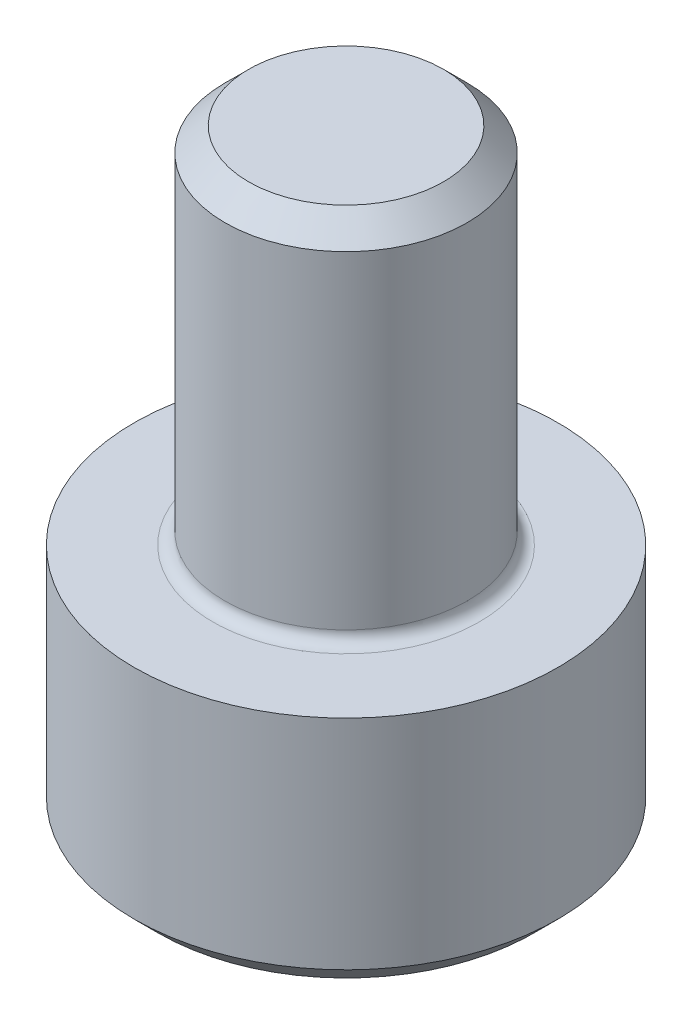
ISO-10303-21;
HEADER;
FILE_DESCRIPTION(('STEP AP214'),'2;1');
FILE_NAME('part.step','',(''),(''),'','','');
FILE_SCHEMA(('AUTOMOTIVE_DESIGN { 1 0 10303 214 1 1 1 1 }'));
ENDSEC;
DATA;
#1=APPLICATION_CONTEXT('core data for automotive mechanical design processes');
#2=APPLICATION_PROTOCOL_DEFINITION('international standard','automotive_design',2000,#1);
#3=PRODUCT_CONTEXT('',#1,'mechanical');
#4=PRODUCT('Part','Part','',(#3));
#5=PRODUCT_RELATED_PRODUCT_CATEGORY('part','',(#4));
#6=PRODUCT_DEFINITION_FORMATION('','',#4);
#7=PRODUCT_DEFINITION_CONTEXT('part definition',#1,'design');
#8=PRODUCT_DEFINITION('design','',#6,#7);
#9=PRODUCT_DEFINITION_SHAPE('','',#8);
#10=(LENGTH_UNIT() NAMED_UNIT(*) SI_UNIT(.MILLI.,.METRE.));
#11=(NAMED_UNIT(*) PLANE_ANGLE_UNIT() SI_UNIT($,.RADIAN.));
#12=(NAMED_UNIT(*) SI_UNIT($,.STERADIAN.) SOLID_ANGLE_UNIT());
#13=UNCERTAINTY_MEASURE_WITH_UNIT(LENGTH_MEASURE(1.E-05),#10,'distance_accuracy_value','');
#14=(GEOMETRIC_REPRESENTATION_CONTEXT(3) GLOBAL_UNCERTAINTY_ASSIGNED_CONTEXT((#13)) GLOBAL_UNIT_ASSIGNED_CONTEXT((#10,
#11,#12)) REPRESENTATION_CONTEXT('',''));
#15=CARTESIAN_POINT('',(0.,0.,0.));
#16=DIRECTION('',(0.,0.,1.));
#17=DIRECTION('',(1.,0.,0.));
#18=AXIS2_PLACEMENT_3D('',#15,#16,#17);
#19=CARTESIAN_POINT('',(8.00000000000001,-78.,-28.9136645896017));
#20=DIRECTION('',(0.,-1.,0.));
#21=DIRECTION('',(0.,0.,1.));
#22=AXIS2_PLACEMENT_3D('',#19,#20,#21);
#23=PLANE('',#22);
#24=DIRECTION('',(0.499999999999999,0.,0.866025403784439));
#25=VECTOR('',#24,1.);
#26=CARTESIAN_POINT('',(6.22695732331867,-78.,-28.9136645896017));
#27=LINE('',#26,#25);
#28=CARTESIAN_POINT('',(6.22695732331867,-78.,-28.9136645896017));
#29=VERTEX_POINT('',#28);
#30=CARTESIAN_POINT('',(7.11347866165934,-78.,-27.3781645896017));
#31=VERTEX_POINT('',#30);
#32=EDGE_CURVE('E269',#29,#31,#27,.T.);
#33=ORIENTED_EDGE('',*,*,#32,.T.);
#34=DIRECTION('',(-1.,0.,0.));
#35=VECTOR('',#34,1.);
#36=CARTESIAN_POINT('',(8.88652133834068,-78.,-27.3781645896017));
#37=LINE('',#36,#35);
#38=CARTESIAN_POINT('',(8.88652133834068,-78.,-27.3781645896017));
#39=VERTEX_POINT('',#38);
#40=EDGE_CURVE('E124',#39,#31,#37,.T.);
#41=ORIENTED_EDGE('',*,*,#40,.F.);
#42=DIRECTION('',(0.500000000000001,0.,-0.866025403784438));
#43=VECTOR('',#42,1.);
#44=CARTESIAN_POINT('',(8.88652133834068,-78.,-27.3781645896017));
#45=LINE('',#44,#43);
#46=CARTESIAN_POINT('',(9.77304267668135,-78.,-28.9136645896017));
#47=VERTEX_POINT('',#46);
#48=EDGE_CURVE('E272',#39,#47,#45,.T.);
#49=ORIENTED_EDGE('',*,*,#48,.T.);
#50=DIRECTION('',(-0.499999999999999,0.,-0.866025403784439));
#51=VECTOR('',#50,1.);
#52=CARTESIAN_POINT('',(9.77304267668135,-78.,-28.9136645896017));
#53=LINE('',#52,#51);
#54=CARTESIAN_POINT('',(8.88652133834068,-78.,-30.4491645896017));
#55=VERTEX_POINT('',#54);
#56=EDGE_CURVE('E275',#47,#55,#53,.T.);
#57=ORIENTED_EDGE('',*,*,#56,.T.);
#58=DIRECTION('',(1.,0.,0.));
#59=VECTOR('',#58,1.);
#60=CARTESIAN_POINT('',(7.11347866165934,-78.,-30.4491645896017));
#61=LINE('',#60,#59);
#62=CARTESIAN_POINT('',(7.11347866165934,-78.,-30.4491645896017));
#63=VERTEX_POINT('',#62);
#64=EDGE_CURVE('E278',#63,#55,#61,.T.);
#65=ORIENTED_EDGE('',*,*,#64,.F.);
#66=DIRECTION('',(0.500000000000001,0.,-0.866025403784438));
#67=VECTOR('',#66,1.);
#68=CARTESIAN_POINT('',(6.22695732331867,-78.,-28.9136645896017));
#69=LINE('',#68,#67);
#70=EDGE_CURVE('E119',#29,#63,#69,.T.);
#71=ORIENTED_EDGE('',*,*,#70,.F.);
#72=EDGE_LOOP('',(#33,#41,#49,#57,#65,#71));
#73=FACE_BOUND('',#72,.T.);
#74=CARTESIAN_POINT('',(8.00000000000001,-78.,-28.9136645896017));
#75=DIRECTION('',(0.,-1.,0.));
#76=DIRECTION('',(0.,0.,1.));
#77=AXIS2_PLACEMENT_3D('',#74,#75,#76);
#78=CIRCLE('',#77,3.1);
#79=CARTESIAN_POINT('',(8.00000000000001,-78.,-25.8136645896017));
#80=VERTEX_POINT('',#79);
#81=EDGE_CURVE('E148',#80,#80,#78,.T.);
#82=ORIENTED_EDGE('',*,*,#81,.T.);
#83=EDGE_LOOP('',(#82));
#84=FACE_BOUND('',#83,.T.);
#85=ADVANCED_FACE('F32',(#73,#84),#23,.T.);
#86=CARTESIAN_POINT('',(8.00000000000001,-78.,-28.9136645896017));
#87=DIRECTION('',(0.,1.,0.));
#88=DIRECTION('',(0.,0.,-1.));
#89=AXIS2_PLACEMENT_3D('',#86,#87,#88);
#90=CONICAL_SURFACE('',#89,3.1,0.785398163397451);
#91=CARTESIAN_POINT('',(8.00000000000001,-77.6,-28.9136645896017));
#92=DIRECTION('',(0.,-1.,0.));
#93=DIRECTION('',(0.,0.,1.));
#94=AXIS2_PLACEMENT_3D('',#91,#92,#93);
#95=CIRCLE('',#94,3.5);
#96=CARTESIAN_POINT('',(8.00000000000001,-77.6,-25.4136645896017));
#97=VERTEX_POINT('',#96);
#98=EDGE_CURVE('E145',#97,#97,#95,.T.);
#99=ORIENTED_EDGE('',*,*,#98,.T.);
#100=EDGE_LOOP('',(#99));
#101=FACE_BOUND('',#100,.T.);
#102=ORIENTED_EDGE('',*,*,#81,.F.);
#103=EDGE_LOOP('',(#102));
#104=FACE_BOUND('',#103,.T.);
#105=ADVANCED_FACE('F170',(#101,#104),#90,.T.);
#106=CARTESIAN_POINT('',(8.00000000000001,-109.75,-28.9136645896017));
#107=DIRECTION('',(0.,-1.,0.));
#108=DIRECTION('',(0.,0.,1.));
#109=AXIS2_PLACEMENT_3D('',#106,#107,#108);
#110=CYLINDRICAL_SURFACE('',#109,3.5);
#111=CARTESIAN_POINT('',(8.00000000000001,-74.,-28.9136645896017));
#112=DIRECTION('',(0.,-1.,0.));
#113=DIRECTION('',(0.,0.,1.));
#114=AXIS2_PLACEMENT_3D('',#111,#112,#113);
#115=CIRCLE('',#114,3.5);
#116=CARTESIAN_POINT('',(8.00000000000001,-74.,-25.4136645896017));
#117=VERTEX_POINT('',#116);
#118=EDGE_CURVE('E142',#117,#117,#115,.T.);
#119=ORIENTED_EDGE('',*,*,#118,.T.);
#120=EDGE_LOOP('',(#119));
#121=FACE_BOUND('',#120,.T.);
#122=ORIENTED_EDGE('',*,*,#98,.F.);
#123=EDGE_LOOP('',(#122));
#124=FACE_BOUND('',#123,.T.);
#125=ADVANCED_FACE('F176',(#121,#124),#110,.T.);
#126=CARTESIAN_POINT('',(4.50000000000001,-74.,-28.9136645896017));
#127=DIRECTION('',(0.,1.,0.));
#128=DIRECTION('',(0.,0.,-1.));
#129=AXIS2_PLACEMENT_3D('',#126,#127,#128);
#130=PLANE('',#129);
#131=CARTESIAN_POINT('',(8.00000000000001,-74.,-28.9136645896017));
#132=DIRECTION('',(0.,1.,0.));
#133=DIRECTION('',(0.,0.,-1.));
#134=AXIS2_PLACEMENT_3D('',#131,#132,#133);
#135=CIRCLE('',#134,2.2);
#136=CARTESIAN_POINT('',(8.00000000000001,-74.,-31.1136645896017));
#137=VERTEX_POINT('',#136);
#138=EDGE_CURVE('E40',#137,#137,#135,.F.);
#139=ORIENTED_EDGE('',*,*,#138,.T.);
#140=EDGE_LOOP('',(#139));
#141=FACE_BOUND('',#140,.T.);
#142=ORIENTED_EDGE('',*,*,#118,.F.);
#143=EDGE_LOOP('',(#142));
#144=FACE_BOUND('',#143,.T.);
#145=ADVANCED_FACE('F153',(#141,#144),#130,.T.);
#146=CARTESIAN_POINT('',(8.00000000000001,-109.75,-28.9136645896017));
#147=DIRECTION('',(0.,-1.,0.));
#148=DIRECTION('',(0.,0.,1.));
#149=AXIS2_PLACEMENT_3D('',#146,#147,#148);
#150=CYLINDRICAL_SURFACE('',#149,2.);
#151=CARTESIAN_POINT('',(8.00000000000001,-73.8,-28.9136645896017));
#152=DIRECTION('',(0.,1.,0.));
#153=DIRECTION('',(0.,0.,-1.));
#154=AXIS2_PLACEMENT_3D('',#151,#152,#153);
#155=CIRCLE('',#154,2.);
#156=CARTESIAN_POINT('',(8.00000000000001,-73.8,-30.9136645896017));
#157=VERTEX_POINT('',#156);
#158=EDGE_CURVE('E11',#157,#157,#155,.T.);
#159=ORIENTED_EDGE('',*,*,#158,.T.);
#160=EDGE_LOOP('',(#159));
#161=FACE_BOUND('',#160,.T.);
#162=CARTESIAN_POINT('',(8.00000000000001,-68.39,-28.9136645896017));
#163=DIRECTION('',(0.,-1.,0.));
#164=DIRECTION('',(0.,0.,1.));
#165=AXIS2_PLACEMENT_3D('',#162,#163,#164);
#166=CIRCLE('',#165,2.);
#167=CARTESIAN_POINT('',(8.00000000000001,-68.39,-26.9136645896016));
#168=VERTEX_POINT('',#167);
#169=EDGE_CURVE('E139',#168,#168,#166,.T.);
#170=ORIENTED_EDGE('',*,*,#169,.T.);
#171=EDGE_LOOP('',(#170));
#172=FACE_BOUND('',#171,.T.);
#173=ADVANCED_FACE('F186',(#161,#172),#150,.T.);
#174=CARTESIAN_POINT('',(8.00000000000001,-68.,-28.9136645896017));
#175=DIRECTION('',(0.,-1.,0.));
#176=DIRECTION('',(0.,0.,1.));
#177=AXIS2_PLACEMENT_3D('',#174,#175,#176);
#178=CONICAL_SURFACE('',#177,1.61,0.785398163397465);
#179=ORIENTED_EDGE('',*,*,#169,.F.);
#180=EDGE_LOOP('',(#179));
#181=FACE_BOUND('',#180,.T.);
#182=CARTESIAN_POINT('',(8.00000000000001,-68.,-28.9136645896017));
#183=DIRECTION('',(0.,-1.,0.));
#184=DIRECTION('',(0.,0.,1.));
#185=AXIS2_PLACEMENT_3D('',#182,#183,#184);
#186=CIRCLE('',#185,1.61);
#187=CARTESIAN_POINT('',(8.00000000000001,-68.,-27.3036645896017));
#188=VERTEX_POINT('',#187);
#189=EDGE_CURVE('E135',#188,#188,#186,.T.);
#190=ORIENTED_EDGE('',*,*,#189,.T.);
#191=EDGE_LOOP('',(#190));
#192=FACE_BOUND('',#191,.T.);
#193=ADVANCED_FACE('F165',(#181,#192),#178,.T.);
#194=CARTESIAN_POINT('',(6.39000000000001,-68.,-28.9136645896017));
#195=DIRECTION('',(0.,1.,0.));
#196=DIRECTION('',(0.,0.,-1.));
#197=AXIS2_PLACEMENT_3D('',#194,#195,#196);
#198=PLANE('',#197);
#199=ORIENTED_EDGE('',*,*,#189,.F.);
#200=EDGE_LOOP('',(#199));
#201=FACE_BOUND('',#200,.T.);
#202=ADVANCED_FACE('F157',(#201),#198,.T.);
#203=CARTESIAN_POINT('',(8.00000000000001,-73.8,-28.9136645896017));
#204=DIRECTION('',(0.,1.,0.));
#205=DIRECTION('',(0.,0.,-1.));
#206=AXIS2_PLACEMENT_3D('',#203,#204,#205);
#207=TOROIDAL_SURFACE('',#206,2.2,0.2);
#208=ORIENTED_EDGE('',*,*,#158,.F.);
#209=EDGE_LOOP('',(#208));
#210=FACE_BOUND('',#209,.T.);
#211=ORIENTED_EDGE('',*,*,#138,.F.);
#212=EDGE_LOOP('',(#211));
#213=FACE_BOUND('',#212,.T.);
#214=ADVANCED_FACE('F34',(#210,#213),#207,.F.);
#215=CARTESIAN_POINT('',(6.22695732331867,-76.,-28.9136645896017));
#216=DIRECTION('',(0.866025403784439,0.,-0.499999999999999));
#217=DIRECTION('',(-0.499999999999999,0.,-0.866025403784439));
#218=AXIS2_PLACEMENT_3D('',#215,#216,#217);
#219=PLANE('',#218);
#220=ORIENTED_EDGE('',*,*,#32,.F.);
#221=DIRECTION('',(0.,-1.,0.));
#222=VECTOR('',#221,1.);
#223=CARTESIAN_POINT('',(6.22695732331867,-76.,-28.9136645896017));
#224=LINE('',#223,#222);
#225=CARTESIAN_POINT('',(6.22695732331867,-76.,-28.9136645896017));
#226=VERTEX_POINT('',#225);
#227=EDGE_CURVE('E268',#226,#29,#224,.T.);
#228=ORIENTED_EDGE('',*,*,#227,.F.);
#229=DIRECTION('',(0.499999999999999,0.,0.866025403784439));
#230=VECTOR('',#229,1.);
#231=CARTESIAN_POINT('',(6.22695732331867,-76.,-28.9136645896017));
#232=LINE('',#231,#230);
#233=CARTESIAN_POINT('',(6.670217992489,-76.,-28.1459145896017));
#234=VERTEX_POINT('',#233);
#235=EDGE_CURVE('E47',#226,#234,#232,.T.);
#236=ORIENTED_EDGE('',*,*,#235,.T.);
#237=CARTESIAN_POINT('',(7.11347866165934,-76.,-27.3781645896017));
#238=VERTEX_POINT('',#237);
#239=EDGE_CURVE('E105',#234,#238,#232,.T.);
#240=ORIENTED_EDGE('',*,*,#239,.T.);
#241=DIRECTION('',(0.,-1.,0.));
#242=VECTOR('',#241,1.);
#243=CARTESIAN_POINT('',(7.11347866165934,-76.,-27.3781645896017));
#244=LINE('',#243,#242);
#245=EDGE_CURVE('E117',#238,#31,#244,.T.);
#246=ORIENTED_EDGE('',*,*,#245,.T.);
#247=EDGE_LOOP('',(#220,#228,#236,#240,#246));
#248=FACE_BOUND('',#247,.T.);
#249=ADVANCED_FACE('F116',(#248),#219,.T.);
#250=CARTESIAN_POINT('',(8.88652133834068,-76.,-27.3781645896017));
#251=DIRECTION('',(0.,0.,1.));
#252=DIRECTION('',(1.,0.,0.));
#253=AXIS2_PLACEMENT_3D('',#250,#251,#252);
#254=PLANE('',#253);
#255=ORIENTED_EDGE('',*,*,#40,.T.);
#256=ORIENTED_EDGE('',*,*,#245,.F.);
#257=DIRECTION('',(-1.,0.,0.));
#258=VECTOR('',#257,1.);
#259=CARTESIAN_POINT('',(8.88652133834068,-76.,-27.3781645896017));
#260=LINE('',#259,#258);
#261=CARTESIAN_POINT('',(8.00000000000001,-76.,-27.3781645896017));
#262=VERTEX_POINT('',#261);
#263=EDGE_CURVE('E103',#262,#238,#260,.T.);
#264=ORIENTED_EDGE('',*,*,#263,.F.);
#265=CARTESIAN_POINT('',(8.88652133834068,-76.,-27.3781645896017));
#266=VERTEX_POINT('',#265);
#267=EDGE_CURVE('E113',#266,#262,#260,.T.);
#268=ORIENTED_EDGE('',*,*,#267,.F.);
#269=DIRECTION('',(0.,-1.,0.));
#270=VECTOR('',#269,1.);
#271=CARTESIAN_POINT('',(8.88652133834068,-76.,-27.3781645896017));
#272=LINE('',#271,#270);
#273=EDGE_CURVE('E126',#266,#39,#272,.T.);
#274=ORIENTED_EDGE('',*,*,#273,.T.);
#275=EDGE_LOOP('',(#255,#256,#264,#268,#274));
#276=FACE_BOUND('',#275,.T.);
#277=ADVANCED_FACE('F121',(#276),#254,.F.);
#278=CARTESIAN_POINT('',(8.88652133834068,-76.,-27.3781645896017));
#279=DIRECTION('',(-0.866025403784438,0.,-0.500000000000001));
#280=DIRECTION('',(-0.500000000000001,0.,0.866025403784438));
#281=AXIS2_PLACEMENT_3D('',#278,#279,#280);
#282=PLANE('',#281);
#283=ORIENTED_EDGE('',*,*,#48,.F.);
#284=ORIENTED_EDGE('',*,*,#273,.F.);
#285=DIRECTION('',(0.500000000000001,0.,-0.866025403784438));
#286=VECTOR('',#285,1.);
#287=CARTESIAN_POINT('',(8.88652133834068,-76.,-27.3781645896017));
#288=LINE('',#287,#286);
#289=CARTESIAN_POINT('',(9.32978200751101,-76.,-28.1459145896016));
#290=VERTEX_POINT('',#289);
#291=EDGE_CURVE('E249',#266,#290,#288,.T.);
#292=ORIENTED_EDGE('',*,*,#291,.T.);
#293=CARTESIAN_POINT('',(9.77304267668135,-76.,-28.9136645896017));
#294=VERTEX_POINT('',#293);
#295=EDGE_CURVE('E251',#290,#294,#288,.T.);
#296=ORIENTED_EDGE('',*,*,#295,.T.);
#297=DIRECTION('',(0.,-1.,0.));
#298=VECTOR('',#297,1.);
#299=CARTESIAN_POINT('',(9.77304267668135,-76.,-28.9136645896017));
#300=LINE('',#299,#298);
#301=EDGE_CURVE('E131',#294,#47,#300,.T.);
#302=ORIENTED_EDGE('',*,*,#301,.T.);
#303=EDGE_LOOP('',(#283,#284,#292,#296,#302));
#304=FACE_BOUND('',#303,.T.);
#305=ADVANCED_FACE('F198',(#304),#282,.T.);
#306=CARTESIAN_POINT('',(9.77304267668135,-76.,-28.9136645896017));
#307=DIRECTION('',(-0.866025403784439,0.,0.499999999999999));
#308=DIRECTION('',(0.499999999999999,0.,0.866025403784439));
#309=AXIS2_PLACEMENT_3D('',#306,#307,#308);
#310=PLANE('',#309);
#311=ORIENTED_EDGE('',*,*,#56,.F.);
#312=ORIENTED_EDGE('',*,*,#301,.F.);
#313=DIRECTION('',(-0.499999999999999,0.,-0.866025403784439));
#314=VECTOR('',#313,1.);
#315=CARTESIAN_POINT('',(9.77304267668135,-76.,-28.9136645896017));
#316=LINE('',#315,#314);
#317=CARTESIAN_POINT('',(9.32978200751102,-76.,-29.6814145896017));
#318=VERTEX_POINT('',#317);
#319=EDGE_CURVE('E254',#294,#318,#316,.T.);
#320=ORIENTED_EDGE('',*,*,#319,.T.);
#321=CARTESIAN_POINT('',(8.88652133834068,-76.,-30.4491645896017));
#322=VERTEX_POINT('',#321);
#323=EDGE_CURVE('E258',#318,#322,#316,.T.);
#324=ORIENTED_EDGE('',*,*,#323,.T.);
#325=DIRECTION('',(0.,-1.,0.));
#326=VECTOR('',#325,1.);
#327=CARTESIAN_POINT('',(8.88652133834068,-76.,-30.4491645896017));
#328=LINE('',#327,#326);
#329=EDGE_CURVE('E287',#322,#55,#328,.T.);
#330=ORIENTED_EDGE('',*,*,#329,.T.);
#331=EDGE_LOOP('',(#311,#312,#320,#324,#330));
#332=FACE_BOUND('',#331,.T.);
#333=ADVANCED_FACE('F201',(#332),#310,.T.);
#334=CARTESIAN_POINT('',(7.11347866165934,-76.,-30.4491645896017));
#335=DIRECTION('',(0.,0.,-1.));
#336=DIRECTION('',(-1.,0.,0.));
#337=AXIS2_PLACEMENT_3D('',#334,#335,#336);
#338=PLANE('',#337);
#339=ORIENTED_EDGE('',*,*,#64,.T.);
#340=ORIENTED_EDGE('',*,*,#329,.F.);
#341=DIRECTION('',(1.,0.,0.));
#342=VECTOR('',#341,1.);
#343=CARTESIAN_POINT('',(7.11347866165934,-76.,-30.4491645896017));
#344=LINE('',#343,#342);
#345=CARTESIAN_POINT('',(8.00000000000001,-76.,-30.4491645896017));
#346=VERTEX_POINT('',#345);
#347=EDGE_CURVE('E262',#346,#322,#344,.T.);
#348=ORIENTED_EDGE('',*,*,#347,.F.);
#349=CARTESIAN_POINT('',(7.11347866165934,-76.,-30.4491645896017));
#350=VERTEX_POINT('',#349);
#351=EDGE_CURVE('E263',#350,#346,#344,.T.);
#352=ORIENTED_EDGE('',*,*,#351,.F.);
#353=DIRECTION('',(0.,-1.,0.));
#354=VECTOR('',#353,1.);
#355=CARTESIAN_POINT('',(7.11347866165934,-76.,-30.4491645896017));
#356=LINE('',#355,#354);
#357=EDGE_CURVE('E284',#350,#63,#356,.T.);
#358=ORIENTED_EDGE('',*,*,#357,.T.);
#359=EDGE_LOOP('',(#339,#340,#348,#352,#358));
#360=FACE_BOUND('',#359,.T.);
#361=ADVANCED_FACE('F205',(#360),#338,.F.);
#362=CARTESIAN_POINT('',(6.22695732331867,-76.,-28.9136645896017));
#363=DIRECTION('',(-0.866025403784438,0.,-0.500000000000001));
#364=DIRECTION('',(-0.500000000000001,0.,0.866025403784438));
#365=AXIS2_PLACEMENT_3D('',#362,#363,#364);
#366=PLANE('',#365);
#367=ORIENTED_EDGE('',*,*,#70,.T.);
#368=ORIENTED_EDGE('',*,*,#357,.F.);
#369=DIRECTION('',(0.500000000000001,0.,-0.866025403784438));
#370=VECTOR('',#369,1.);
#371=CARTESIAN_POINT('',(6.22695732331867,-76.,-28.9136645896017));
#372=LINE('',#371,#370);
#373=CARTESIAN_POINT('',(6.670217992489,-76.,-29.6814145896017));
#374=VERTEX_POINT('',#373);
#375=EDGE_CURVE('E266',#374,#350,#372,.T.);
#376=ORIENTED_EDGE('',*,*,#375,.F.);
#377=EDGE_CURVE('E240',#226,#374,#372,.T.);
#378=ORIENTED_EDGE('',*,*,#377,.F.);
#379=ORIENTED_EDGE('',*,*,#227,.T.);
#380=EDGE_LOOP('',(#367,#368,#376,#378,#379));
#381=FACE_BOUND('',#380,.T.);
#382=ADVANCED_FACE('F209',(#381),#366,.F.);
#383=CARTESIAN_POINT('',(7.11347866165934,-76.,-27.3781645896017));
#384=DIRECTION('',(0.,-1.,0.));
#385=DIRECTION('',(0.,0.,1.));
#386=AXIS2_PLACEMENT_3D('',#383,#384,#385);
#387=PLANE('',#386);
#388=CARTESIAN_POINT('',(8.00000000000001,-76.,-28.9136645896017));
#389=DIRECTION('',(0.,-1.,0.));
#390=DIRECTION('',(0.,0.,1.));
#391=AXIS2_PLACEMENT_3D('',#388,#389,#390);
#392=CIRCLE('',#391,1.5355);
#393=EDGE_CURVE('E125',#290,#262,#392,.T.);
#394=ORIENTED_EDGE('',*,*,#393,.F.);
#395=ORIENTED_EDGE('',*,*,#291,.F.);
#396=ORIENTED_EDGE('',*,*,#267,.T.);
#397=EDGE_LOOP('',(#394,#395,#396));
#398=FACE_BOUND('',#397,.T.);
#399=ADVANCED_FACE('F213',(#398),#387,.T.);
#400=EDGE_CURVE('E129',#318,#290,#392,.T.);
#401=ORIENTED_EDGE('',*,*,#400,.F.);
#402=ORIENTED_EDGE('',*,*,#319,.F.);
#403=ORIENTED_EDGE('',*,*,#295,.F.);
#404=EDGE_LOOP('',(#401,#402,#403));
#405=FACE_BOUND('',#404,.T.);
#406=ADVANCED_FACE('F216',(#405),#387,.T.);
#407=EDGE_CURVE('E293',#346,#318,#392,.T.);
#408=ORIENTED_EDGE('',*,*,#407,.F.);
#409=ORIENTED_EDGE('',*,*,#347,.T.);
#410=ORIENTED_EDGE('',*,*,#323,.F.);
#411=EDGE_LOOP('',(#408,#409,#410));
#412=FACE_BOUND('',#411,.T.);
#413=ADVANCED_FACE('F222',(#412),#387,.T.);
#414=EDGE_CURVE('E243',#374,#346,#392,.T.);
#415=ORIENTED_EDGE('',*,*,#414,.F.);
#416=ORIENTED_EDGE('',*,*,#375,.T.);
#417=ORIENTED_EDGE('',*,*,#351,.T.);
#418=EDGE_LOOP('',(#415,#416,#417));
#419=FACE_BOUND('',#418,.T.);
#420=ADVANCED_FACE('F230',(#419),#387,.T.);
#421=EDGE_CURVE('E136',#234,#374,#392,.T.);
#422=ORIENTED_EDGE('',*,*,#421,.F.);
#423=ORIENTED_EDGE('',*,*,#235,.F.);
#424=ORIENTED_EDGE('',*,*,#377,.T.);
#425=EDGE_LOOP('',(#422,#423,#424));
#426=FACE_BOUND('',#425,.T.);
#427=ADVANCED_FACE('F225',(#426),#387,.T.);
#428=EDGE_CURVE('E108',#262,#234,#392,.T.);
#429=ORIENTED_EDGE('',*,*,#428,.F.);
#430=ORIENTED_EDGE('',*,*,#263,.T.);
#431=ORIENTED_EDGE('',*,*,#239,.F.);
#432=EDGE_LOOP('',(#429,#430,#431));
#433=FACE_BOUND('',#432,.T.);
#434=ADVANCED_FACE('F104',(#433),#387,.T.);
#435=CARTESIAN_POINT('',(8.00000000000001,-76.,-28.9136645896017));
#436=DIRECTION('',(0.,-1.,0.));
#437=DIRECTION('',(0.,0.,1.));
#438=AXIS2_PLACEMENT_3D('',#435,#436,#437);
#439=CONICAL_SURFACE('',#438,1.5355,1.04719755119659);
#440=CARTESIAN_POINT('',(8.00000000000001,-75.1134786616593,-28.9136645896017));
#441=VERTEX_POINT('',#440);
#442=VERTEX_LOOP('',#441);
#443=FACE_BOUND('',#442,.T.);
#444=ORIENTED_EDGE('',*,*,#428,.T.);
#445=ORIENTED_EDGE('',*,*,#421,.T.);
#446=ORIENTED_EDGE('',*,*,#414,.T.);
#447=ORIENTED_EDGE('',*,*,#407,.T.);
#448=ORIENTED_EDGE('',*,*,#400,.T.);
#449=ORIENTED_EDGE('',*,*,#393,.T.);
#450=EDGE_LOOP('',(#444,#445,#446,#447,#448,#449));
#451=FACE_BOUND('',#450,.T.);
#452=ADVANCED_FACE('F193',(#443,#451),#439,.F.);
#453=CLOSED_SHELL('',(#85,#105,#125,#145,#173,#193,#202,#214,#249,#277,#305,#333,#361,#382,#399,
#406,#413,#420,#427,#434,#452));
#454=MANIFOLD_SOLID_BREP('B2',#453);
#455=ADVANCED_BREP_SHAPE_REPRESENTATION('',(#18,#454),#14);
#456=SHAPE_DEFINITION_REPRESENTATION(#9,#455);
ENDSEC;
END-ISO-10303-21;
